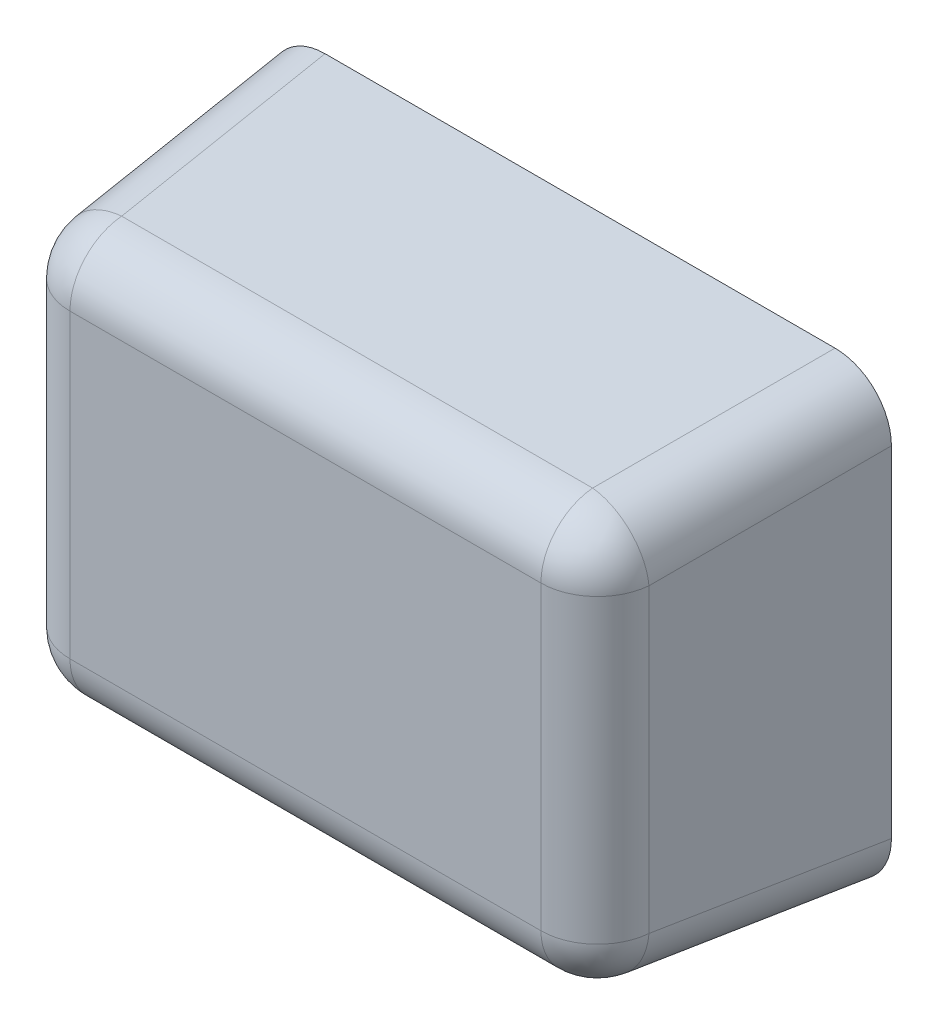
ISO-10303-21;
HEADER;
FILE_DESCRIPTION(('STEP AP214'),'2;1');
FILE_NAME('part.step','',(''),(''),'','','');
FILE_SCHEMA(('AUTOMOTIVE_DESIGN { 1 0 10303 214 1 1 1 1 }'));
ENDSEC;
DATA;
#1=APPLICATION_CONTEXT('core data for automotive mechanical design processes');
#2=APPLICATION_PROTOCOL_DEFINITION('international standard','automotive_design',2000,#1);
#3=PRODUCT_CONTEXT('',#1,'mechanical');
#4=PRODUCT('Part','Part','',(#3));
#5=PRODUCT_RELATED_PRODUCT_CATEGORY('part','',(#4));
#6=PRODUCT_DEFINITION_FORMATION('','',#4);
#7=PRODUCT_DEFINITION_CONTEXT('part definition',#1,'design');
#8=PRODUCT_DEFINITION('design','',#6,#7);
#9=PRODUCT_DEFINITION_SHAPE('','',#8);
#10=(LENGTH_UNIT() NAMED_UNIT(*) SI_UNIT(.MILLI.,.METRE.));
#11=(NAMED_UNIT(*) PLANE_ANGLE_UNIT() SI_UNIT($,.RADIAN.));
#12=(NAMED_UNIT(*) SI_UNIT($,.STERADIAN.) SOLID_ANGLE_UNIT());
#13=UNCERTAINTY_MEASURE_WITH_UNIT(LENGTH_MEASURE(1.E-05),#10,'distance_accuracy_value','');
#14=(GEOMETRIC_REPRESENTATION_CONTEXT(3) GLOBAL_UNCERTAINTY_ASSIGNED_CONTEXT((#13)) GLOBAL_UNIT_ASSIGNED_CONTEXT((#10,
#11,#12)) REPRESENTATION_CONTEXT('',''));
#15=CARTESIAN_POINT('',(0.,0.,0.));
#16=DIRECTION('',(0.,0.,1.));
#17=DIRECTION('',(1.,0.,0.));
#18=AXIS2_PLACEMENT_3D('',#15,#16,#17);
#19=CARTESIAN_POINT('',(0.785000000033,0.,0.007643090947518));
#20=DIRECTION('',(0.,0.,1.));
#21=DIRECTION('',(1.,0.,0.));
#22=AXIS2_PLACEMENT_3D('',#19,#20,#21);
#23=PLANE('',#22);
#24=CARTESIAN_POINT('',(0.335381983787,-0.299618016246,0.007643090947518));
#25=DIRECTION('',(0.,0.,1.));
#26=DIRECTION('',(-0.707106781186548,-0.707106781186548,0.));
#27=AXIS2_PLACEMENT_3D('',#24,#25,#26);
#28=ELLIPSE('',#27,0.100762519445,0.1);
#29=CARTESIAN_POINT('',(0.235000000033,-0.300380530191,0.007643090947518));
#30=VERTEX_POINT('',#29);
#31=CARTESIAN_POINT('',(0.334619469842,-0.4,0.007643090947518));
#32=VERTEX_POINT('',#31);
#33=EDGE_CURVE('E122',#30,#32,#28,.T.);
#34=ORIENTED_EDGE('',*,*,#33,.F.);
#35=DIRECTION('',(0.,-1.,0.));
#36=VECTOR('',#35,1.);
#37=CARTESIAN_POINT('',(0.235000000033,0.4,0.007643090947518));
#38=LINE('',#37,#36);
#39=CARTESIAN_POINT('',(0.235000000033,0.300380530191,0.007643090947518));
#40=VERTEX_POINT('',#39);
#41=EDGE_CURVE('E220',#40,#30,#38,.T.);
#42=ORIENTED_EDGE('',*,*,#41,.F.);
#43=CARTESIAN_POINT('',(0.335381983787,0.299618016246,0.007643090947518));
#44=DIRECTION('',(0.,0.,1.));
#45=DIRECTION('',(-0.707106781186548,0.707106781186548,0.));
#46=AXIS2_PLACEMENT_3D('',#43,#44,#45);
#47=ELLIPSE('',#46,0.100762519445,0.1);
#48=CARTESIAN_POINT('',(0.334619469842,0.4,0.007643090947518));
#49=VERTEX_POINT('',#48);
#50=EDGE_CURVE('E153',#49,#40,#47,.T.);
#51=ORIENTED_EDGE('',*,*,#50,.F.);
#52=DIRECTION('',(-1.,0.,0.));
#53=VECTOR('',#52,1.);
#54=CARTESIAN_POINT('',(1.335000000033,0.4,0.007643090947518));
#55=LINE('',#54,#53);
#56=CARTESIAN_POINT('',(1.235380530223,0.4,0.007643090947518));
#57=VERTEX_POINT('',#56);
#58=EDGE_CURVE('E38',#57,#49,#55,.T.);
#59=ORIENTED_EDGE('',*,*,#58,.F.);
#60=CARTESIAN_POINT('',(1.234618016278,0.299618016246,0.007643090947518));
#61=DIRECTION('',(0.,0.,1.));
#62=DIRECTION('',(0.707106781186548,0.707106781186548,0.));
#63=AXIS2_PLACEMENT_3D('',#60,#61,#62);
#64=ELLIPSE('',#63,0.100762519445,0.1);
#65=CARTESIAN_POINT('',(1.335000000033,0.300380530191,0.007643090947518));
#66=VERTEX_POINT('',#65);
#67=EDGE_CURVE('E215',#66,#57,#64,.T.);
#68=ORIENTED_EDGE('',*,*,#67,.F.);
#69=DIRECTION('',(0.,1.,0.));
#70=VECTOR('',#69,1.);
#71=CARTESIAN_POINT('',(1.335000000033,-0.4,0.007643090947518));
#72=LINE('',#71,#70);
#73=CARTESIAN_POINT('',(1.335000000033,-0.300380530191,0.007643090947518));
#74=VERTEX_POINT('',#73);
#75=EDGE_CURVE('E26',#74,#66,#72,.T.);
#76=ORIENTED_EDGE('',*,*,#75,.F.);
#77=CARTESIAN_POINT('',(1.234618016278,-0.299618016246,0.007643090947518));
#78=DIRECTION('',(0.,0.,1.));
#79=DIRECTION('',(0.707106781186548,-0.707106781186548,0.));
#80=AXIS2_PLACEMENT_3D('',#77,#78,#79);
#81=ELLIPSE('',#80,0.100762519445,0.1);
#82=CARTESIAN_POINT('',(1.235380530223,-0.4,0.007643090947518));
#83=VERTEX_POINT('',#82);
#84=EDGE_CURVE('E124',#83,#74,#81,.T.);
#85=ORIENTED_EDGE('',*,*,#84,.F.);
#86=DIRECTION('',(1.,0.,0.));
#87=VECTOR('',#86,1.);
#88=CARTESIAN_POINT('',(0.235000000033,-0.4,0.007643090947518));
#89=LINE('',#88,#87);
#90=EDGE_CURVE('E11',#32,#83,#89,.T.);
#91=ORIENTED_EDGE('',*,*,#90,.F.);
#92=EDGE_LOOP('',(#34,#42,#51,#59,#68,#76,#85,#91));
#93=FACE_BOUND('',#92,.T.);
#94=ADVANCED_FACE('F17',(#93),#23,.F.);
#95=CARTESIAN_POINT('',(1.335000000033,-0.4,0.007643090947518));
#96=DIRECTION('',(0.,-0.996194698091747,0.0871557427476379));
#97=DIRECTION('',(-1.,0.,0.));
#98=AXIS2_PLACEMENT_3D('',#95,#96,#97);
#99=PLANE('',#98);
#100=DIRECTION('',(0.0868265938642471,0.0868265938642471,0.992432509138967));
#101=VECTOR('',#100,1.);
#102=CARTESIAN_POINT('',(0.338014824436,-0.396604645406,0.0464521715408));
#103=LINE('',#102,#101);
#104=CARTESIAN_POINT('',(0.369065119244,-0.365554350597,0.401358665222));
#105=VERTEX_POINT('',#104);
#106=EDGE_CURVE('E129',#32,#105,#103,.T.);
#107=ORIENTED_EDGE('',*,*,#106,.F.);
#108=ORIENTED_EDGE('',*,*,#90,.T.);
#109=DIRECTION('',(0.0868265938642471,-0.0868265938642471,-0.992432509138967));
#110=VECTOR('',#109,1.);
#111=CARTESIAN_POINT('',(1.23311600424,-0.397735474017,0.0335267413795));
#112=LINE('',#111,#110);
#113=CARTESIAN_POINT('',(1.200934880821,-0.365554350597,0.401358665222));
#114=VERTEX_POINT('',#113);
#115=EDGE_CURVE('E204',#114,#83,#112,.T.);
#116=ORIENTED_EDGE('',*,*,#115,.F.);
#117=DIRECTION('',(1.,0.,0.));
#118=VECTOR('',#117,1.);
#119=CARTESIAN_POINT('',(1.060000000033,-0.365554350597,0.401358665222));
#120=LINE('',#119,#118);
#121=EDGE_CURVE('E130',#105,#114,#120,.T.);
#122=ORIENTED_EDGE('',*,*,#121,.F.);
#123=EDGE_LOOP('',(#107,#108,#116,#122));
#124=FACE_BOUND('',#123,.T.);
#125=ADVANCED_FACE('F19',(#124),#99,.T.);
#126=CARTESIAN_POINT('',(1.335000000033,0.4,0.007643090947518));
#127=DIRECTION('',(0.996194698091747,0.,0.0871557427476379));
#128=DIRECTION('',(0.,-1.,0.));
#129=AXIS2_PLACEMENT_3D('',#126,#127,#128);
#130=PLANE('',#129);
#131=DIRECTION('',(-0.0868265938642471,0.0868265938642471,0.992432509138967));
#132=VECTOR('',#131,1.);
#133=CARTESIAN_POINT('',(1.332735474049,-0.298116004207,0.0335267413795));
#134=LINE('',#133,#132);
#135=CARTESIAN_POINT('',(1.30055435063,-0.265934880788,0.401358665222));
#136=VERTEX_POINT('',#135);
#137=EDGE_CURVE('E200',#74,#136,#134,.T.);
#138=ORIENTED_EDGE('',*,*,#137,.F.);
#139=ORIENTED_EDGE('',*,*,#75,.T.);
#140=DIRECTION('',(0.0868265938642471,0.0868265938642471,-0.992432509138967));
#141=VECTOR('',#140,1.);
#142=CARTESIAN_POINT('',(1.331604645439,0.296985175597,0.0464521715408));
#143=LINE('',#142,#141);
#144=CARTESIAN_POINT('',(1.30055435063,0.265934880788,0.401358665222));
#145=VERTEX_POINT('',#144);
#146=EDGE_CURVE('E227',#145,#66,#143,.T.);
#147=ORIENTED_EDGE('',*,*,#146,.F.);
#148=DIRECTION('',(0.,1.,0.));
#149=VECTOR('',#148,1.);
#150=CARTESIAN_POINT('',(1.30055435063,0.2,0.401358665222));
#151=LINE('',#150,#149);
#152=EDGE_CURVE('E237',#136,#145,#151,.T.);
#153=ORIENTED_EDGE('',*,*,#152,.F.);
#154=EDGE_LOOP('',(#138,#139,#147,#153));
#155=FACE_BOUND('',#154,.T.);
#156=ADVANCED_FACE('F272',(#155),#130,.T.);
#157=CARTESIAN_POINT('',(0.785000000033,0.,0.492643090948));
#158=DIRECTION('',(0.,0.,1.));
#159=DIRECTION('',(1.,0.,0.));
#160=AXIS2_PLACEMENT_3D('',#157,#158,#159);
#161=PLANE('',#160);
#162=DIRECTION('',(0.,1.,0.));
#163=VECTOR('',#162,1.);
#164=CARTESIAN_POINT('',(0.369065119244,-0.2,0.492643090948));
#165=LINE('',#164,#163);
#166=CARTESIAN_POINT('',(0.369065119244,-0.265934880788,0.492643090948));
#167=VERTEX_POINT('',#166);
#168=CARTESIAN_POINT('',(0.369065119244,0.265934880788,0.492643090948));
#169=VERTEX_POINT('',#168);
#170=EDGE_CURVE('E180',#167,#169,#165,.T.);
#171=ORIENTED_EDGE('',*,*,#170,.F.);
#172=DIRECTION('',(-1.,0.,0.));
#173=VECTOR('',#172,1.);
#174=CARTESIAN_POINT('',(1.060000000033,-0.265934880788,0.492643090948));
#175=LINE('',#174,#173);
#176=CARTESIAN_POINT('',(1.200934880821,-0.265934880788,0.492643090948));
#177=VERTEX_POINT('',#176);
#178=EDGE_CURVE('E223',#177,#167,#175,.T.);
#179=ORIENTED_EDGE('',*,*,#178,.F.);
#180=DIRECTION('',(0.,-1.,0.));
#181=VECTOR('',#180,1.);
#182=CARTESIAN_POINT('',(1.200934880821,0.2,0.492643090948));
#183=LINE('',#182,#181);
#184=CARTESIAN_POINT('',(1.200934880821,0.265934880788,0.492643090948));
#185=VERTEX_POINT('',#184);
#186=EDGE_CURVE('E240',#185,#177,#183,.T.);
#187=ORIENTED_EDGE('',*,*,#186,.F.);
#188=DIRECTION('',(1.,0.,0.));
#189=VECTOR('',#188,1.);
#190=CARTESIAN_POINT('',(0.510000000033,0.265934880788,0.492643090948));
#191=LINE('',#190,#189);
#192=EDGE_CURVE('E233',#169,#185,#191,.T.);
#193=ORIENTED_EDGE('',*,*,#192,.F.);
#194=EDGE_LOOP('',(#171,#179,#187,#193));
#195=FACE_BOUND('',#194,.T.);
#196=ADVANCED_FACE('F313',(#195),#161,.T.);
#197=CARTESIAN_POINT('',(0.235000000033,0.4,0.007643090947518));
#198=DIRECTION('',(0.,0.996194698091747,0.0871557427476379));
#199=DIRECTION('',(1.,0.,0.));
#200=AXIS2_PLACEMENT_3D('',#197,#198,#199);
#201=PLANE('',#200);
#202=DIRECTION('',(-0.0868265938642471,0.0868265938642471,-0.992432509138967));
#203=VECTOR('',#202,1.);
#204=CARTESIAN_POINT('',(0.336883995825,0.397735474017,0.0335267413795));
#205=LINE('',#204,#203);
#206=CARTESIAN_POINT('',(0.369065119244,0.365554350597,0.401358665222));
#207=VERTEX_POINT('',#206);
#208=EDGE_CURVE('E162',#207,#49,#205,.T.);
#209=ORIENTED_EDGE('',*,*,#208,.F.);
#210=DIRECTION('',(-1.,0.,0.));
#211=VECTOR('',#210,1.);
#212=CARTESIAN_POINT('',(0.510000000033,0.365554350597,0.401358665222));
#213=LINE('',#212,#211);
#214=CARTESIAN_POINT('',(1.200934880821,0.365554350597,0.401358665222));
#215=VERTEX_POINT('',#214);
#216=EDGE_CURVE('E230',#215,#207,#213,.T.);
#217=ORIENTED_EDGE('',*,*,#216,.F.);
#218=DIRECTION('',(-0.0868265938642471,-0.0868265938642471,0.992432509138967));
#219=VECTOR('',#218,1.);
#220=CARTESIAN_POINT('',(1.23198517563,0.396604645406,0.0464521715408));
#221=LINE('',#220,#219);
#222=EDGE_CURVE('E219',#57,#215,#221,.T.);
#223=ORIENTED_EDGE('',*,*,#222,.F.);
#224=ORIENTED_EDGE('',*,*,#58,.T.);
#225=EDGE_LOOP('',(#209,#217,#223,#224));
#226=FACE_BOUND('',#225,.T.);
#227=ADVANCED_FACE('F250',(#226),#201,.T.);
#228=CARTESIAN_POINT('',(0.235000000033,-0.4,0.007643090947518));
#229=DIRECTION('',(-0.996194698091747,0.,0.0871557427476379));
#230=DIRECTION('',(0.,1.,0.));
#231=AXIS2_PLACEMENT_3D('',#228,#229,#230);
#232=PLANE('',#231);
#233=DIRECTION('',(-0.0868265938642471,-0.0868265938642471,-0.992432509138967));
#234=VECTOR('',#233,1.);
#235=CARTESIAN_POINT('',(0.238395354626,-0.296985175597,0.0464521715408));
#236=LINE('',#235,#234);
#237=CARTESIAN_POINT('',(0.269445649435,-0.265934880788,0.401358665222));
#238=VERTEX_POINT('',#237);
#239=EDGE_CURVE('E135',#238,#30,#236,.T.);
#240=ORIENTED_EDGE('',*,*,#239,.F.);
#241=DIRECTION('',(0.,-1.,0.));
#242=VECTOR('',#241,1.);
#243=CARTESIAN_POINT('',(0.269445649435,-0.2,0.401358665222));
#244=LINE('',#243,#242);
#245=CARTESIAN_POINT('',(0.269445649435,0.265934880788,0.401358665222));
#246=VERTEX_POINT('',#245);
#247=EDGE_CURVE('E173',#246,#238,#244,.T.);
#248=ORIENTED_EDGE('',*,*,#247,.F.);
#249=DIRECTION('',(0.0868265938642471,-0.0868265938642471,0.992432509138967));
#250=VECTOR('',#249,1.);
#251=CARTESIAN_POINT('',(0.237264526016,0.298116004207,0.0335267413795));
#252=LINE('',#251,#250);
#253=EDGE_CURVE('E157',#40,#246,#252,.T.);
#254=ORIENTED_EDGE('',*,*,#253,.F.);
#255=ORIENTED_EDGE('',*,*,#41,.T.);
#256=EDGE_LOOP('',(#240,#248,#254,#255));
#257=FACE_BOUND('',#256,.T.);
#258=ADVANCED_FACE('F256',(#257),#232,.T.);
#259=CARTESIAN_POINT('',(1.060000000033,-0.265934880788,0.392643090948));
#260=DIRECTION('',(-1.,0.,0.));
#261=DIRECTION('',(0.,-0.675590207615907,0.737277336809898));
#262=AXIS2_PLACEMENT_3D('',#259,#260,#261);
#263=CYLINDRICAL_SURFACE('',#262,0.1);
#264=CARTESIAN_POINT('',(0.369065119244,-0.265934880788,0.392643090948));
#265=DIRECTION('',(-1.,0.,0.));
#266=DIRECTION('',(0.,0.,1.));
#267=AXIS2_PLACEMENT_3D('',#264,#265,#266);
#268=CIRCLE('',#267,0.1);
#269=EDGE_CURVE('E141',#105,#167,#268,.T.);
#270=ORIENTED_EDGE('',*,*,#269,.F.);
#271=ORIENTED_EDGE('',*,*,#121,.T.);
#272=CARTESIAN_POINT('',(1.200934880821,-0.265934880788,0.392643090948));
#273=DIRECTION('',(1.,0.,0.));
#274=DIRECTION('',(0.,-0.996194698091747,0.0871557427476379));
#275=AXIS2_PLACEMENT_3D('',#272,#273,#274);
#276=CIRCLE('',#275,0.1);
#277=EDGE_CURVE('E184',#177,#114,#276,.T.);
#278=ORIENTED_EDGE('',*,*,#277,.F.);
#279=ORIENTED_EDGE('',*,*,#178,.T.);
#280=EDGE_LOOP('',(#270,#271,#278,#279));
#281=FACE_BOUND('',#280,.T.);
#282=ADVANCED_FACE('F281',(#281),#263,.T.);
#283=CARTESIAN_POINT('',(1.200934880821,0.2,0.392643090948));
#284=DIRECTION('',(0.,-1.,0.));
#285=DIRECTION('',(0.675590207615907,0.,0.737277336809898));
#286=AXIS2_PLACEMENT_3D('',#283,#284,#285);
#287=CYLINDRICAL_SURFACE('',#286,0.1);
#288=CARTESIAN_POINT('',(1.200934880821,-0.265934880788,0.392643090948));
#289=DIRECTION('',(0.,-1.,0.));
#290=DIRECTION('',(0.,0.,1.));
#291=AXIS2_PLACEMENT_3D('',#288,#289,#290);
#292=CIRCLE('',#291,0.1);
#293=EDGE_CURVE('E194',#136,#177,#292,.T.);
#294=ORIENTED_EDGE('',*,*,#293,.F.);
#295=ORIENTED_EDGE('',*,*,#152,.T.);
#296=CARTESIAN_POINT('',(1.200934880821,0.265934880788,0.392643090948));
#297=DIRECTION('',(0.,1.,0.));
#298=DIRECTION('',(0.996194698091747,0.,0.0871557427476379));
#299=AXIS2_PLACEMENT_3D('',#296,#297,#298);
#300=CIRCLE('',#299,0.1);
#301=EDGE_CURVE('E152',#185,#145,#300,.T.);
#302=ORIENTED_EDGE('',*,*,#301,.F.);
#303=ORIENTED_EDGE('',*,*,#186,.T.);
#304=EDGE_LOOP('',(#294,#295,#302,#303));
#305=FACE_BOUND('',#304,.T.);
#306=ADVANCED_FACE('F348',(#305),#287,.T.);
#307=CARTESIAN_POINT('',(0.510000000033,0.265934880788,0.392643090948));
#308=DIRECTION('',(1.,0.,0.));
#309=DIRECTION('',(0.,0.675590207615907,0.737277336809898));
#310=AXIS2_PLACEMENT_3D('',#307,#308,#309);
#311=CYLINDRICAL_SURFACE('',#310,0.1);
#312=CARTESIAN_POINT('',(1.200934880821,0.265934880788,0.392643090948));
#313=DIRECTION('',(1.,0.,0.));
#314=DIRECTION('',(0.,0.,1.));
#315=AXIS2_PLACEMENT_3D('',#312,#313,#314);
#316=CIRCLE('',#315,0.1);
#317=EDGE_CURVE('E211',#215,#185,#316,.T.);
#318=ORIENTED_EDGE('',*,*,#317,.F.);
#319=ORIENTED_EDGE('',*,*,#216,.T.);
#320=CARTESIAN_POINT('',(0.369065119244,0.265934880788,0.392643090948));
#321=DIRECTION('',(-1.,0.,0.));
#322=DIRECTION('',(0.,0.996194698091747,0.0871557427476379));
#323=AXIS2_PLACEMENT_3D('',#320,#321,#322);
#324=CIRCLE('',#323,0.1);
#325=EDGE_CURVE('E165',#169,#207,#324,.T.);
#326=ORIENTED_EDGE('',*,*,#325,.F.);
#327=ORIENTED_EDGE('',*,*,#192,.T.);
#328=EDGE_LOOP('',(#318,#319,#326,#327));
#329=FACE_BOUND('',#328,.T.);
#330=ADVANCED_FACE('F267',(#329),#311,.T.);
#331=CARTESIAN_POINT('',(1.23198517563,0.296985175597,0.03773659726603));
#332=DIRECTION('',(-0.0868265938639312,-0.0868265938639312,0.992432509139022));
#333=DIRECTION('',(0.701755757082183,0.701755757082183,0.122791346617032));
#334=AXIS2_PLACEMENT_3D('',#331,#332,#333);
#335=CYLINDRICAL_SURFACE('',#334,0.1);
#336=ORIENTED_EDGE('',*,*,#67,.T.);
#337=ORIENTED_EDGE('',*,*,#222,.T.);
#338=CARTESIAN_POINT('',(1.200934880821,0.265934880788,0.392643090948));
#339=DIRECTION('',(-0.0868265938642471,-0.0868265938642274,0.992432509138969));
#340=DIRECTION('',(0.,0.996194698091747,0.0871557427476379));
#341=AXIS2_PLACEMENT_3D('',#338,#339,#340);
#342=CIRCLE('',#341,0.1);
#343=EDGE_CURVE('E207',#145,#215,#342,.T.);
#344=ORIENTED_EDGE('',*,*,#343,.F.);
#345=ORIENTED_EDGE('',*,*,#146,.T.);
#346=EDGE_LOOP('',(#336,#337,#344,#345));
#347=FACE_BOUND('',#346,.T.);
#348=ADVANCED_FACE('F270',(#347),#335,.T.);
#349=CARTESIAN_POINT('',(1.200934880821,0.265934880788,0.392643090948));
#350=DIRECTION('',(0.351373447904943,-0.839628904299864,0.414198024103933));
#351=DIRECTION('',(0.543160476345881,0.543160476345881,0.64027602943686));
#352=AXIS2_PLACEMENT_3D('',#349,#350,#351);
#353=SPHERICAL_SURFACE('',#352,0.1);
#354=ORIENTED_EDGE('',*,*,#301,.T.);
#355=ORIENTED_EDGE('',*,*,#343,.T.);
#356=ORIENTED_EDGE('',*,*,#317,.T.);
#357=EDGE_LOOP('',(#354,#355,#356));
#358=FACE_BOUND('',#357,.T.);
#359=ADVANCED_FACE('F371',(#358),#353,.T.);
#360=CARTESIAN_POINT('',(1.23311600424,-0.298116004207,0.02481116710473));
#361=DIRECTION('',(-0.0868265938639312,0.0868265938639312,0.992432509139022));
#362=DIRECTION('',(0.701755757082183,-0.701755757082183,0.122791346617032));
#363=AXIS2_PLACEMENT_3D('',#360,#361,#362);
#364=CYLINDRICAL_SURFACE('',#363,0.1);
#365=ORIENTED_EDGE('',*,*,#84,.T.);
#366=ORIENTED_EDGE('',*,*,#137,.T.);
#367=CARTESIAN_POINT('',(1.200934880821,-0.265934880788,0.392643090948));
#368=DIRECTION('',(-0.0868265938642274,0.0868265938642471,0.992432509138969));
#369=DIRECTION('',(0.996194698091747,0.,0.0871557427476379));
#370=AXIS2_PLACEMENT_3D('',#367,#368,#369);
#371=CIRCLE('',#370,0.1);
#372=EDGE_CURVE('E190',#114,#136,#371,.T.);
#373=ORIENTED_EDGE('',*,*,#372,.F.);
#374=ORIENTED_EDGE('',*,*,#115,.T.);
#375=EDGE_LOOP('',(#365,#366,#373,#374));
#376=FACE_BOUND('',#375,.T.);
#377=ADVANCED_FACE('F276',(#376),#364,.T.);
#378=CARTESIAN_POINT('',(1.200934880821,-0.265934880788,0.392643090948));
#379=DIRECTION('',(-0.351373447904943,-0.839628904299864,-0.414198024103933));
#380=DIRECTION('',(0.543160476345881,-0.543160476345881,0.64027602943686));
#381=AXIS2_PLACEMENT_3D('',#378,#379,#380);
#382=SPHERICAL_SURFACE('',#381,0.1);
#383=ORIENTED_EDGE('',*,*,#277,.T.);
#384=ORIENTED_EDGE('',*,*,#372,.T.);
#385=ORIENTED_EDGE('',*,*,#293,.T.);
#386=EDGE_LOOP('',(#383,#384,#385));
#387=FACE_BOUND('',#386,.T.);
#388=ADVANCED_FACE('F279',(#387),#382,.T.);
#389=CARTESIAN_POINT('',(0.369065119244,-0.2,0.392643090948));
#390=DIRECTION('',(0.,1.,0.));
#391=DIRECTION('',(-0.675590207615907,0.,0.737277336809898));
#392=AXIS2_PLACEMENT_3D('',#389,#390,#391);
#393=CYLINDRICAL_SURFACE('',#392,0.1);
#394=CARTESIAN_POINT('',(0.369065119244,0.265934880788,0.392643090948));
#395=DIRECTION('',(0.,1.,0.));
#396=DIRECTION('',(0.,0.,1.));
#397=AXIS2_PLACEMENT_3D('',#394,#395,#396);
#398=CIRCLE('',#397,0.1);
#399=EDGE_CURVE('E158',#246,#169,#398,.T.);
#400=ORIENTED_EDGE('',*,*,#399,.F.);
#401=ORIENTED_EDGE('',*,*,#247,.T.);
#402=CARTESIAN_POINT('',(0.369065119244,-0.265934880788,0.392643090948));
#403=DIRECTION('',(0.,-1.,0.));
#404=DIRECTION('',(-0.996194698091747,0.,0.0871557427476379));
#405=AXIS2_PLACEMENT_3D('',#402,#403,#404);
#406=CIRCLE('',#405,0.1);
#407=EDGE_CURVE('E289',#167,#238,#406,.T.);
#408=ORIENTED_EDGE('',*,*,#407,.F.);
#409=ORIENTED_EDGE('',*,*,#170,.T.);
#410=EDGE_LOOP('',(#400,#401,#408,#409));
#411=FACE_BOUND('',#410,.T.);
#412=ADVANCED_FACE('F259',(#411),#393,.T.);
#413=CARTESIAN_POINT('',(0.336883995825,0.298116004207,0.02481116710473));
#414=DIRECTION('',(0.0868265938639312,-0.0868265938639312,0.992432509139022));
#415=DIRECTION('',(-0.701755757082183,0.701755757082183,0.122791346617032));
#416=AXIS2_PLACEMENT_3D('',#413,#414,#415);
#417=CYLINDRICAL_SURFACE('',#416,0.1);
#418=ORIENTED_EDGE('',*,*,#50,.T.);
#419=ORIENTED_EDGE('',*,*,#253,.T.);
#420=CARTESIAN_POINT('',(0.369065119244,0.265934880788,0.392643090948));
#421=DIRECTION('',(0.0868265938642274,-0.0868265938642471,0.992432509138969));
#422=DIRECTION('',(-0.996194698091747,0.,0.0871557427476379));
#423=AXIS2_PLACEMENT_3D('',#420,#421,#422);
#424=CIRCLE('',#423,0.1);
#425=EDGE_CURVE('E169',#207,#246,#424,.T.);
#426=ORIENTED_EDGE('',*,*,#425,.F.);
#427=ORIENTED_EDGE('',*,*,#208,.T.);
#428=EDGE_LOOP('',(#418,#419,#426,#427));
#429=FACE_BOUND('',#428,.T.);
#430=ADVANCED_FACE('F253',(#429),#417,.T.);
#431=CARTESIAN_POINT('',(0.369065119244,0.265934880788,0.392643090948));
#432=DIRECTION('',(-0.351373447904943,-0.839628904299864,0.414198024103933));
#433=DIRECTION('',(-0.543160476345881,0.543160476345881,0.64027602943686));
#434=AXIS2_PLACEMENT_3D('',#431,#432,#433);
#435=SPHERICAL_SURFACE('',#434,0.1);
#436=ORIENTED_EDGE('',*,*,#325,.T.);
#437=ORIENTED_EDGE('',*,*,#425,.T.);
#438=ORIENTED_EDGE('',*,*,#399,.T.);
#439=EDGE_LOOP('',(#436,#437,#438));
#440=FACE_BOUND('',#439,.T.);
#441=ADVANCED_FACE('F264',(#440),#435,.T.);
#442=CARTESIAN_POINT('',(0.338014824436,-0.296985175597,0.03773659726603));
#443=DIRECTION('',(0.0868265938639312,0.0868265938639312,0.992432509139022));
#444=DIRECTION('',(-0.701755757082183,-0.701755757082183,0.122791346617032));
#445=AXIS2_PLACEMENT_3D('',#442,#443,#444);
#446=CYLINDRICAL_SURFACE('',#445,0.1);
#447=ORIENTED_EDGE('',*,*,#33,.T.);
#448=ORIENTED_EDGE('',*,*,#106,.T.);
#449=CARTESIAN_POINT('',(0.369065119244,-0.265934880788,0.392643090948));
#450=DIRECTION('',(0.0868265938642471,0.0868265938642274,0.992432509138969));
#451=DIRECTION('',(0.,-0.996194698091747,0.0871557427476379));
#452=AXIS2_PLACEMENT_3D('',#449,#450,#451);
#453=CIRCLE('',#452,0.1);
#454=EDGE_CURVE('E148',#238,#105,#453,.T.);
#455=ORIENTED_EDGE('',*,*,#454,.F.);
#456=ORIENTED_EDGE('',*,*,#239,.T.);
#457=EDGE_LOOP('',(#447,#448,#455,#456));
#458=FACE_BOUND('',#457,.T.);
#459=ADVANCED_FACE('F138',(#458),#446,.T.);
#460=CARTESIAN_POINT('',(0.369065119244,-0.265934880788,0.392643090948));
#461=DIRECTION('',(0.351373447904943,-0.839628904299864,-0.414198024103933));
#462=DIRECTION('',(-0.543160476345881,-0.543160476345881,0.64027602943686));
#463=AXIS2_PLACEMENT_3D('',#460,#461,#462);
#464=SPHERICAL_SURFACE('',#463,0.1);
#465=ORIENTED_EDGE('',*,*,#407,.T.);
#466=ORIENTED_EDGE('',*,*,#454,.T.);
#467=ORIENTED_EDGE('',*,*,#269,.T.);
#468=EDGE_LOOP('',(#465,#466,#467));
#469=FACE_BOUND('',#468,.T.);
#470=ADVANCED_FACE('F297',(#469),#464,.T.);
#471=CLOSED_SHELL('',(#94,#125,#156,#196,#227,#258,#282,#306,#330,#348,#359,#377,#388,#412,#430,
#441,#459,#470));
#472=MANIFOLD_SOLID_BREP('B1',#471);
#473=ADVANCED_BREP_SHAPE_REPRESENTATION('',(#18,#472),#14);
#474=SHAPE_DEFINITION_REPRESENTATION(#9,#473);
ENDSEC;
END-ISO-10303-21;
